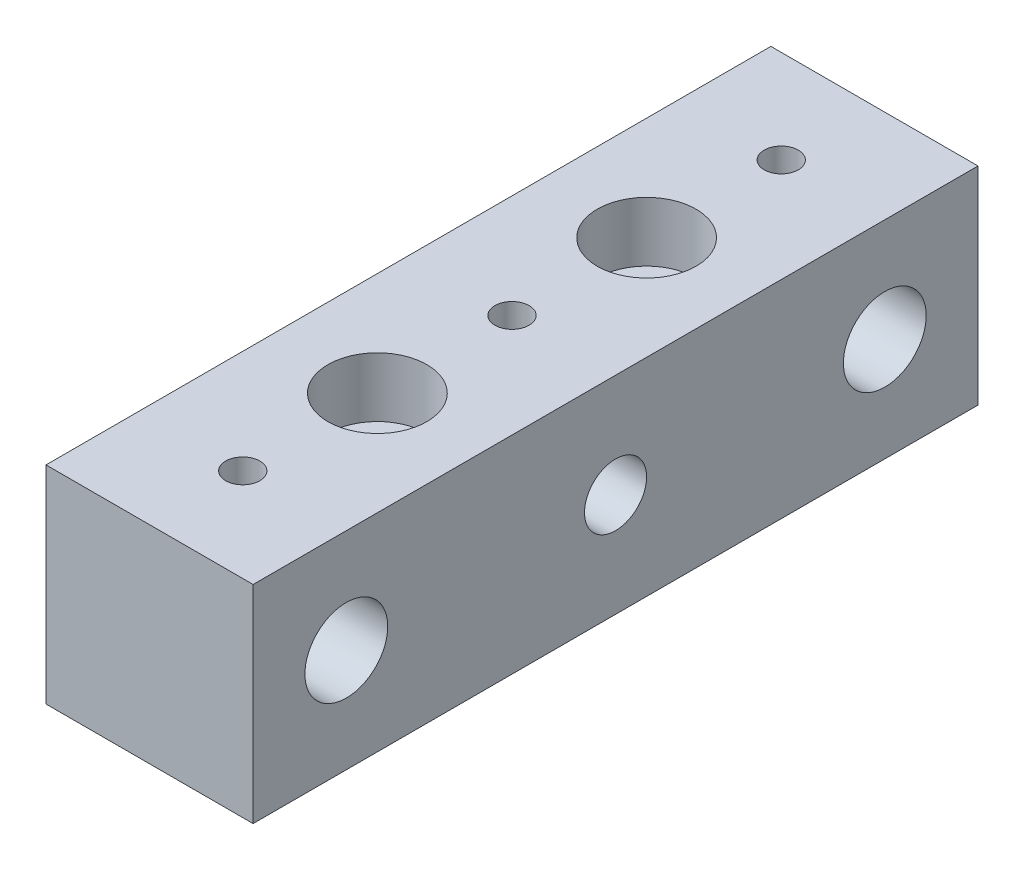
ISO-10303-21;
HEADER;
FILE_DESCRIPTION(('STEP AP214'),'2;1');
FILE_NAME('part.step','',(''),(''),'','','');
FILE_SCHEMA(('AUTOMOTIVE_DESIGN { 1 0 10303 214 1 1 1 1 }'));
ENDSEC;
DATA;
#1=APPLICATION_CONTEXT('core data for automotive mechanical design processes');
#2=APPLICATION_PROTOCOL_DEFINITION('international standard','automotive_design',2000,#1);
#3=PRODUCT_CONTEXT('',#1,'mechanical');
#4=PRODUCT('Part','Part','',(#3));
#5=PRODUCT_RELATED_PRODUCT_CATEGORY('part','',(#4));
#6=PRODUCT_DEFINITION_FORMATION('','',#4);
#7=PRODUCT_DEFINITION_CONTEXT('part definition',#1,'design');
#8=PRODUCT_DEFINITION('design','',#6,#7);
#9=PRODUCT_DEFINITION_SHAPE('','',#8);
#10=(LENGTH_UNIT() NAMED_UNIT(*) SI_UNIT(.MILLI.,.METRE.));
#11=(NAMED_UNIT(*) PLANE_ANGLE_UNIT() SI_UNIT($,.RADIAN.));
#12=(NAMED_UNIT(*) SI_UNIT($,.STERADIAN.) SOLID_ANGLE_UNIT());
#13=UNCERTAINTY_MEASURE_WITH_UNIT(LENGTH_MEASURE(1.E-05),#10,'distance_accuracy_value','');
#14=(GEOMETRIC_REPRESENTATION_CONTEXT(3) GLOBAL_UNCERTAINTY_ASSIGNED_CONTEXT((#13)) GLOBAL_UNIT_ASSIGNED_CONTEXT((#10,
#11,#12)) REPRESENTATION_CONTEXT('',''));
#15=CARTESIAN_POINT('',(0.,0.,0.));
#16=DIRECTION('',(0.,0.,1.));
#17=DIRECTION('',(1.,0.,0.));
#18=AXIS2_PLACEMENT_3D('',#15,#16,#17);
#19=CARTESIAN_POINT('',(10.,-20.,35.));
#20=DIRECTION('',(1.,0.,0.));
#21=DIRECTION('',(0.,0.,-1.));
#22=AXIS2_PLACEMENT_3D('',#19,#20,#21);
#23=PLANE('',#22);
#24=CARTESIAN_POINT('',(10.,-10.,26.));
#25=DIRECTION('',(1.,0.,0.));
#26=DIRECTION('',(0.,0.,-1.));
#27=AXIS2_PLACEMENT_3D('',#24,#25,#26);
#28=CIRCLE('',#27,4.);
#29=CARTESIAN_POINT('',(10.,-10.,22.));
#30=VERTEX_POINT('',#29);
#31=EDGE_CURVE('E200',#30,#30,#28,.T.);
#32=ORIENTED_EDGE('',*,*,#31,.F.);
#33=EDGE_LOOP('',(#32));
#34=FACE_BOUND('',#33,.T.);
#35=CARTESIAN_POINT('',(10.,-10.,-26.));
#36=DIRECTION('',(1.,0.,0.));
#37=DIRECTION('',(0.,0.,-1.));
#38=AXIS2_PLACEMENT_3D('',#35,#36,#37);
#39=CIRCLE('',#38,4.);
#40=CARTESIAN_POINT('',(10.,-10.,-30.));
#41=VERTEX_POINT('',#40);
#42=EDGE_CURVE('E205',#41,#41,#39,.T.);
#43=ORIENTED_EDGE('',*,*,#42,.F.);
#44=EDGE_LOOP('',(#43));
#45=FACE_BOUND('',#44,.T.);
#46=CARTESIAN_POINT('',(10.,-10.,0.));
#47=DIRECTION('',(1.,0.,0.));
#48=DIRECTION('',(0.,0.,-1.));
#49=AXIS2_PLACEMENT_3D('',#46,#47,#48);
#50=CIRCLE('',#49,3.);
#51=CARTESIAN_POINT('',(10.,-10.,-3.));
#52=VERTEX_POINT('',#51);
#53=EDGE_CURVE('E208',#52,#52,#50,.T.);
#54=ORIENTED_EDGE('',*,*,#53,.F.);
#55=EDGE_LOOP('',(#54));
#56=FACE_BOUND('',#55,.T.);
#57=DIRECTION('',(0.,0.,-1.));
#58=VECTOR('',#57,1.);
#59=CARTESIAN_POINT('',(10.,0.,35.));
#60=LINE('',#59,#58);
#61=CARTESIAN_POINT('',(10.,0.,35.));
#62=VERTEX_POINT('',#61);
#63=CARTESIAN_POINT('',(10.,0.,-35.));
#64=VERTEX_POINT('',#63);
#65=EDGE_CURVE('E110',#62,#64,#60,.T.);
#66=ORIENTED_EDGE('',*,*,#65,.F.);
#67=DIRECTION('',(0.,1.,0.));
#68=VECTOR('',#67,1.);
#69=CARTESIAN_POINT('',(10.,-20.,35.));
#70=LINE('',#69,#68);
#71=CARTESIAN_POINT('',(10.,-20.,35.));
#72=VERTEX_POINT('',#71);
#73=EDGE_CURVE('E11',#72,#62,#70,.T.);
#74=ORIENTED_EDGE('',*,*,#73,.F.);
#75=DIRECTION('',(0.,0.,-1.));
#76=VECTOR('',#75,1.);
#77=CARTESIAN_POINT('',(10.,-20.,35.));
#78=LINE('',#77,#76);
#79=CARTESIAN_POINT('',(10.,-20.,-35.));
#80=VERTEX_POINT('',#79);
#81=EDGE_CURVE('E99',#72,#80,#78,.T.);
#82=ORIENTED_EDGE('',*,*,#81,.T.);
#83=DIRECTION('',(0.,1.,0.));
#84=VECTOR('',#83,1.);
#85=CARTESIAN_POINT('',(10.,-20.,-35.));
#86=LINE('',#85,#84);
#87=EDGE_CURVE('E44',#80,#64,#86,.T.);
#88=ORIENTED_EDGE('',*,*,#87,.T.);
#89=EDGE_LOOP('',(#66,#74,#82,#88));
#90=FACE_BOUND('',#89,.T.);
#91=ADVANCED_FACE('F45',(#34,#45,#56,#90),#23,.T.);
#92=CARTESIAN_POINT('',(-10.,-20.,35.));
#93=DIRECTION('',(0.,0.,1.));
#94=DIRECTION('',(1.,0.,0.));
#95=AXIS2_PLACEMENT_3D('',#92,#93,#94);
#96=PLANE('',#95);
#97=DIRECTION('',(1.,0.,0.));
#98=VECTOR('',#97,1.);
#99=CARTESIAN_POINT('',(-10.,0.,35.));
#100=LINE('',#99,#98);
#101=CARTESIAN_POINT('',(-10.,0.,35.));
#102=VERTEX_POINT('',#101);
#103=EDGE_CURVE('E105',#102,#62,#100,.T.);
#104=ORIENTED_EDGE('',*,*,#103,.F.);
#105=DIRECTION('',(0.,1.,0.));
#106=VECTOR('',#105,1.);
#107=CARTESIAN_POINT('',(-10.,-20.,35.));
#108=LINE('',#107,#106);
#109=CARTESIAN_POINT('',(-10.,-20.,35.));
#110=VERTEX_POINT('',#109);
#111=EDGE_CURVE('E51',#110,#102,#108,.T.);
#112=ORIENTED_EDGE('',*,*,#111,.F.);
#113=DIRECTION('',(1.,0.,0.));
#114=VECTOR('',#113,1.);
#115=CARTESIAN_POINT('',(-10.,-20.,35.));
#116=LINE('',#115,#114);
#117=EDGE_CURVE('E100',#110,#72,#116,.T.);
#118=ORIENTED_EDGE('',*,*,#117,.T.);
#119=ORIENTED_EDGE('',*,*,#73,.T.);
#120=EDGE_LOOP('',(#104,#112,#118,#119));
#121=FACE_BOUND('',#120,.T.);
#122=ADVANCED_FACE('F117',(#121),#96,.T.);
#123=CARTESIAN_POINT('',(-10.,-20.,35.));
#124=DIRECTION('',(-1.,0.,0.));
#125=DIRECTION('',(0.,0.,1.));
#126=AXIS2_PLACEMENT_3D('',#123,#124,#125);
#127=PLANE('',#126);
#128=CARTESIAN_POINT('',(-10.,-10.,26.));
#129=DIRECTION('',(1.,0.,0.));
#130=DIRECTION('',(0.,0.,-1.));
#131=AXIS2_PLACEMENT_3D('',#128,#129,#130);
#132=CIRCLE('',#131,4.);
#133=CARTESIAN_POINT('',(-10.,-10.,22.));
#134=VERTEX_POINT('',#133);
#135=EDGE_CURVE('E191',#134,#134,#132,.T.);
#136=ORIENTED_EDGE('',*,*,#135,.T.);
#137=EDGE_LOOP('',(#136));
#138=FACE_BOUND('',#137,.T.);
#139=CARTESIAN_POINT('',(-10.,-10.,-26.));
#140=DIRECTION('',(1.,0.,0.));
#141=DIRECTION('',(0.,0.,-1.));
#142=AXIS2_PLACEMENT_3D('',#139,#140,#141);
#143=CIRCLE('',#142,4.);
#144=CARTESIAN_POINT('',(-10.,-10.,-30.));
#145=VERTEX_POINT('',#144);
#146=EDGE_CURVE('E202',#145,#145,#143,.T.);
#147=ORIENTED_EDGE('',*,*,#146,.T.);
#148=EDGE_LOOP('',(#147));
#149=FACE_BOUND('',#148,.T.);
#150=CARTESIAN_POINT('',(-10.,-10.,0.));
#151=DIRECTION('',(1.,0.,0.));
#152=DIRECTION('',(0.,0.,-1.));
#153=AXIS2_PLACEMENT_3D('',#150,#151,#152);
#154=CIRCLE('',#153,3.);
#155=CARTESIAN_POINT('',(-10.,-10.,-3.));
#156=VERTEX_POINT('',#155);
#157=EDGE_CURVE('E211',#156,#156,#154,.T.);
#158=ORIENTED_EDGE('',*,*,#157,.T.);
#159=EDGE_LOOP('',(#158));
#160=FACE_BOUND('',#159,.T.);
#161=DIRECTION('',(0.,0.,1.));
#162=VECTOR('',#161,1.);
#163=CARTESIAN_POINT('',(-10.,0.,35.));
#164=LINE('',#163,#162);
#165=CARTESIAN_POINT('',(-10.,0.,-35.));
#166=VERTEX_POINT('',#165);
#167=EDGE_CURVE('E95',#166,#102,#164,.T.);
#168=ORIENTED_EDGE('',*,*,#167,.F.);
#169=DIRECTION('',(0.,1.,0.));
#170=VECTOR('',#169,1.);
#171=CARTESIAN_POINT('',(-10.,-20.,-35.));
#172=LINE('',#171,#170);
#173=CARTESIAN_POINT('',(-10.,-20.,-35.));
#174=VERTEX_POINT('',#173);
#175=EDGE_CURVE('E87',#174,#166,#172,.T.);
#176=ORIENTED_EDGE('',*,*,#175,.F.);
#177=DIRECTION('',(0.,0.,1.));
#178=VECTOR('',#177,1.);
#179=CARTESIAN_POINT('',(-10.,-20.,35.));
#180=LINE('',#179,#178);
#181=EDGE_CURVE('E89',#174,#110,#180,.T.);
#182=ORIENTED_EDGE('',*,*,#181,.T.);
#183=ORIENTED_EDGE('',*,*,#111,.T.);
#184=EDGE_LOOP('',(#168,#176,#182,#183));
#185=FACE_BOUND('',#184,.T.);
#186=ADVANCED_FACE('F90',(#138,#149,#160,#185),#127,.T.);
#187=CARTESIAN_POINT('',(-10.,-20.,-35.));
#188=DIRECTION('',(0.,0.,-1.));
#189=DIRECTION('',(-1.,0.,0.));
#190=AXIS2_PLACEMENT_3D('',#187,#188,#189);
#191=PLANE('',#190);
#192=DIRECTION('',(-1.,0.,0.));
#193=VECTOR('',#192,1.);
#194=CARTESIAN_POINT('',(-10.,0.,-35.));
#195=LINE('',#194,#193);
#196=EDGE_CURVE('E109',#64,#166,#195,.T.);
#197=ORIENTED_EDGE('',*,*,#196,.F.);
#198=ORIENTED_EDGE('',*,*,#87,.F.);
#199=DIRECTION('',(-1.,0.,0.));
#200=VECTOR('',#199,1.);
#201=CARTESIAN_POINT('',(-10.,-20.,-35.));
#202=LINE('',#201,#200);
#203=EDGE_CURVE('E96',#80,#174,#202,.T.);
#204=ORIENTED_EDGE('',*,*,#203,.T.);
#205=ORIENTED_EDGE('',*,*,#175,.T.);
#206=EDGE_LOOP('',(#197,#198,#204,#205));
#207=FACE_BOUND('',#206,.T.);
#208=ADVANCED_FACE('F97',(#207),#191,.T.);
#209=CARTESIAN_POINT('',(0.,-20.,0.));
#210=DIRECTION('',(0.,-1.,0.));
#211=DIRECTION('',(0.,0.,-1.));
#212=AXIS2_PLACEMENT_3D('',#209,#210,#211);
#213=PLANE('',#212);
#214=CARTESIAN_POINT('',(0.,-20.,-13.));
#215=DIRECTION('',(0.,1.,0.));
#216=DIRECTION('',(0.,0.,1.));
#217=AXIS2_PLACEMENT_3D('',#214,#215,#216);
#218=CIRCLE('',#217,2.65);
#219=CARTESIAN_POINT('',(0.,-20.,-10.35));
#220=VERTEX_POINT('',#219);
#221=EDGE_CURVE('E214',#220,#220,#218,.T.);
#222=ORIENTED_EDGE('',*,*,#221,.T.);
#223=EDGE_LOOP('',(#222));
#224=FACE_BOUND('',#223,.T.);
#225=CARTESIAN_POINT('',(0.,-20.,13.));
#226=DIRECTION('',(0.,1.,0.));
#227=DIRECTION('',(0.,0.,1.));
#228=AXIS2_PLACEMENT_3D('',#225,#226,#227);
#229=CIRCLE('',#228,2.65);
#230=CARTESIAN_POINT('',(0.,-20.,15.65));
#231=VERTEX_POINT('',#230);
#232=EDGE_CURVE('E196',#231,#231,#229,.T.);
#233=ORIENTED_EDGE('',*,*,#232,.T.);
#234=EDGE_LOOP('',(#233));
#235=FACE_BOUND('',#234,.T.);
#236=ORIENTED_EDGE('',*,*,#81,.F.);
#237=ORIENTED_EDGE('',*,*,#117,.F.);
#238=ORIENTED_EDGE('',*,*,#181,.F.);
#239=ORIENTED_EDGE('',*,*,#203,.F.);
#240=EDGE_LOOP('',(#236,#237,#238,#239));
#241=FACE_BOUND('',#240,.T.);
#242=ADVANCED_FACE('F92',(#224,#235,#241),#213,.T.);
#243=CARTESIAN_POINT('',(0.,0.,0.));
#244=DIRECTION('',(0.,-1.,0.));
#245=DIRECTION('',(0.,0.,-1.));
#246=AXIS2_PLACEMENT_3D('',#243,#244,#245);
#247=PLANE('',#246);
#248=CARTESIAN_POINT('',(0.,0.,26.));
#249=DIRECTION('',(0.,1.,0.));
#250=DIRECTION('',(0.,0.,1.));
#251=AXIS2_PLACEMENT_3D('',#248,#249,#250);
#252=CIRCLE('',#251,1.65);
#253=CARTESIAN_POINT('',(0.,0.,27.65));
#254=VERTEX_POINT('',#253);
#255=EDGE_CURVE('E212',#254,#254,#252,.T.);
#256=ORIENTED_EDGE('',*,*,#255,.F.);
#257=EDGE_LOOP('',(#256));
#258=FACE_BOUND('',#257,.T.);
#259=CARTESIAN_POINT('',(0.,0.,-26.));
#260=DIRECTION('',(0.,1.,0.));
#261=DIRECTION('',(0.,0.,1.));
#262=AXIS2_PLACEMENT_3D('',#259,#260,#261);
#263=CIRCLE('',#262,1.65);
#264=CARTESIAN_POINT('',(0.,0.,-24.35));
#265=VERTEX_POINT('',#264);
#266=EDGE_CURVE('E194',#265,#265,#263,.T.);
#267=ORIENTED_EDGE('',*,*,#266,.F.);
#268=EDGE_LOOP('',(#267));
#269=FACE_BOUND('',#268,.T.);
#270=CARTESIAN_POINT('',(0.,0.,0.));
#271=DIRECTION('',(0.,1.,0.));
#272=DIRECTION('',(0.,0.,1.));
#273=AXIS2_PLACEMENT_3D('',#270,#271,#272);
#274=CIRCLE('',#273,1.65);
#275=CARTESIAN_POINT('',(0.,0.,1.65));
#276=VERTEX_POINT('',#275);
#277=EDGE_CURVE('E192',#276,#276,#274,.T.);
#278=ORIENTED_EDGE('',*,*,#277,.F.);
#279=EDGE_LOOP('',(#278));
#280=FACE_BOUND('',#279,.T.);
#281=CARTESIAN_POINT('',(0.,0.,-13.));
#282=DIRECTION('',(0.,1.,0.));
#283=DIRECTION('',(0.,0.,1.));
#284=AXIS2_PLACEMENT_3D('',#281,#282,#283);
#285=CIRCLE('',#284,4.775);
#286=CARTESIAN_POINT('',(0.,0.,-8.225));
#287=VERTEX_POINT('',#286);
#288=EDGE_CURVE('E227',#287,#287,#285,.T.);
#289=ORIENTED_EDGE('',*,*,#288,.F.);
#290=EDGE_LOOP('',(#289));
#291=FACE_BOUND('',#290,.T.);
#292=CARTESIAN_POINT('',(0.,0.,13.));
#293=DIRECTION('',(0.,1.,0.));
#294=DIRECTION('',(0.,0.,1.));
#295=AXIS2_PLACEMENT_3D('',#292,#293,#294);
#296=CIRCLE('',#295,4.775);
#297=CARTESIAN_POINT('',(0.,0.,17.775));
#298=VERTEX_POINT('',#297);
#299=EDGE_CURVE('E233',#298,#298,#296,.T.);
#300=ORIENTED_EDGE('',*,*,#299,.F.);
#301=EDGE_LOOP('',(#300));
#302=FACE_BOUND('',#301,.T.);
#303=ORIENTED_EDGE('',*,*,#65,.T.);
#304=ORIENTED_EDGE('',*,*,#196,.T.);
#305=ORIENTED_EDGE('',*,*,#167,.T.);
#306=ORIENTED_EDGE('',*,*,#103,.T.);
#307=EDGE_LOOP('',(#303,#304,#305,#306));
#308=FACE_BOUND('',#307,.T.);
#309=ADVANCED_FACE('F119',(#258,#269,#280,#291,#302,#308),#247,.F.);
#310=CARTESIAN_POINT('',(0.,-5.75,13.));
#311=DIRECTION('',(0.,1.,0.));
#312=DIRECTION('',(0.,0.,1.));
#313=AXIS2_PLACEMENT_3D('',#310,#311,#312);
#314=CYLINDRICAL_SURFACE('',#313,4.775);
#315=CARTESIAN_POINT('',(0.,-5.75,13.));
#316=DIRECTION('',(0.,1.,0.));
#317=DIRECTION('',(0.,0.,1.));
#318=AXIS2_PLACEMENT_3D('',#315,#316,#317);
#319=CIRCLE('',#318,4.775);
#320=CARTESIAN_POINT('',(0.,-5.75,17.775));
#321=VERTEX_POINT('',#320);
#322=EDGE_CURVE('E220',#321,#321,#319,.T.);
#323=ORIENTED_EDGE('',*,*,#322,.F.);
#324=EDGE_LOOP('',(#323));
#325=FACE_BOUND('',#324,.T.);
#326=ORIENTED_EDGE('',*,*,#299,.T.);
#327=EDGE_LOOP('',(#326));
#328=FACE_BOUND('',#327,.T.);
#329=ADVANCED_FACE('F143',(#325,#328),#314,.F.);
#330=CARTESIAN_POINT('',(0.,-5.75,13.));
#331=DIRECTION('',(0.,1.,0.));
#332=DIRECTION('',(0.,0.,1.));
#333=AXIS2_PLACEMENT_3D('',#330,#331,#332);
#334=PLANE('',#333);
#335=CARTESIAN_POINT('',(0.,-5.75,13.));
#336=DIRECTION('',(0.,1.,0.));
#337=DIRECTION('',(0.,0.,1.));
#338=AXIS2_PLACEMENT_3D('',#335,#336,#337);
#339=CIRCLE('',#338,2.65);
#340=CARTESIAN_POINT('',(0.,-5.75,15.65));
#341=VERTEX_POINT('',#340);
#342=EDGE_CURVE('E222',#341,#341,#339,.T.);
#343=ORIENTED_EDGE('',*,*,#342,.F.);
#344=EDGE_LOOP('',(#343));
#345=FACE_BOUND('',#344,.T.);
#346=ORIENTED_EDGE('',*,*,#322,.T.);
#347=EDGE_LOOP('',(#346));
#348=FACE_BOUND('',#347,.T.);
#349=ADVANCED_FACE('F148',(#345,#348),#334,.T.);
#350=CARTESIAN_POINT('',(0.,-5.75,-13.));
#351=DIRECTION('',(0.,1.,0.));
#352=DIRECTION('',(0.,0.,1.));
#353=AXIS2_PLACEMENT_3D('',#350,#351,#352);
#354=CYLINDRICAL_SURFACE('',#353,4.775);
#355=CARTESIAN_POINT('',(0.,-5.75,-13.));
#356=DIRECTION('',(0.,1.,0.));
#357=DIRECTION('',(0.,0.,1.));
#358=AXIS2_PLACEMENT_3D('',#355,#356,#357);
#359=CIRCLE('',#358,4.775);
#360=CARTESIAN_POINT('',(0.,-5.75,-8.225));
#361=VERTEX_POINT('',#360);
#362=EDGE_CURVE('E112',#361,#361,#359,.T.);
#363=ORIENTED_EDGE('',*,*,#362,.F.);
#364=EDGE_LOOP('',(#363));
#365=FACE_BOUND('',#364,.T.);
#366=ORIENTED_EDGE('',*,*,#288,.T.);
#367=EDGE_LOOP('',(#366));
#368=FACE_BOUND('',#367,.T.);
#369=ADVANCED_FACE('F146',(#365,#368),#354,.F.);
#370=CARTESIAN_POINT('',(0.,-5.75,-13.));
#371=DIRECTION('',(0.,1.,0.));
#372=DIRECTION('',(0.,0.,1.));
#373=AXIS2_PLACEMENT_3D('',#370,#371,#372);
#374=PLANE('',#373);
#375=CARTESIAN_POINT('',(0.,-5.75,-13.));
#376=DIRECTION('',(0.,1.,0.));
#377=DIRECTION('',(0.,0.,1.));
#378=AXIS2_PLACEMENT_3D('',#375,#376,#377);
#379=CIRCLE('',#378,2.65);
#380=CARTESIAN_POINT('',(0.,-5.75,-10.35));
#381=VERTEX_POINT('',#380);
#382=EDGE_CURVE('E217',#381,#381,#379,.T.);
#383=ORIENTED_EDGE('',*,*,#382,.F.);
#384=EDGE_LOOP('',(#383));
#385=FACE_BOUND('',#384,.T.);
#386=ORIENTED_EDGE('',*,*,#362,.T.);
#387=EDGE_LOOP('',(#386));
#388=FACE_BOUND('',#387,.T.);
#389=ADVANCED_FACE('F153',(#385,#388),#374,.T.);
#390=CARTESIAN_POINT('',(0.,-20.,13.));
#391=DIRECTION('',(0.,1.,0.));
#392=DIRECTION('',(0.,0.,1.));
#393=AXIS2_PLACEMENT_3D('',#390,#391,#392);
#394=CYLINDRICAL_SURFACE('',#393,2.65);
#395=CARTESIAN_POINT('',(0.,-20.,15.65));
#396=CARTESIAN_POINT('',(0.,-19.8515625,15.65));
#397=CARTESIAN_POINT('',(0.,-19.703125,15.65));
#398=CARTESIAN_POINT('',(0.,-19.40625,15.65));
#399=CARTESIAN_POINT('',(0.,-19.2578125,15.65));
#400=CARTESIAN_POINT('',(0.,-18.9609375,15.65));
#401=CARTESIAN_POINT('',(0.,-18.8125,15.65));
#402=CARTESIAN_POINT('',(0.,-18.515625,15.65));
#403=CARTESIAN_POINT('',(0.,-18.3671875,15.65));
#404=CARTESIAN_POINT('',(0.,-18.0703125,15.65));
#405=CARTESIAN_POINT('',(0.,-17.921875,15.65));
#406=CARTESIAN_POINT('',(0.,-17.625,15.65));
#407=CARTESIAN_POINT('',(0.,-17.4765625,15.65));
#408=CARTESIAN_POINT('',(0.,-17.1796875,15.65));
#409=CARTESIAN_POINT('',(0.,-17.03125,15.65));
#410=CARTESIAN_POINT('',(0.,-16.734375,15.65));
#411=CARTESIAN_POINT('',(0.,-16.5859375,15.65));
#412=CARTESIAN_POINT('',(0.,-16.2890625,15.65));
#413=CARTESIAN_POINT('',(0.,-16.140625,15.65));
#414=CARTESIAN_POINT('',(0.,-15.84375,15.65));
#415=CARTESIAN_POINT('',(0.,-15.6953125,15.65));
#416=CARTESIAN_POINT('',(0.,-15.3984375,15.65));
#417=CARTESIAN_POINT('',(0.,-15.25,15.65));
#418=CARTESIAN_POINT('',(0.,-14.953125,15.65));
#419=CARTESIAN_POINT('',(0.,-14.8046875,15.65));
#420=CARTESIAN_POINT('',(0.,-14.5078125,15.65));
#421=CARTESIAN_POINT('',(0.,-14.359375,15.65));
#422=CARTESIAN_POINT('',(0.,-14.0625,15.65));
#423=CARTESIAN_POINT('',(0.,-13.9140625,15.65));
#424=CARTESIAN_POINT('',(0.,-13.6171875,15.65));
#425=CARTESIAN_POINT('',(0.,-13.46875,15.65));
#426=CARTESIAN_POINT('',(0.,-13.171875,15.65));
#427=CARTESIAN_POINT('',(0.,-13.0234375,15.65));
#428=CARTESIAN_POINT('',(0.,-12.7265625,15.65));
#429=CARTESIAN_POINT('',(0.,-12.578125,15.65));
#430=CARTESIAN_POINT('',(0.,-12.28125,15.65));
#431=CARTESIAN_POINT('',(0.,-12.1328125,15.65));
#432=CARTESIAN_POINT('',(0.,-11.8359375,15.65));
#433=CARTESIAN_POINT('',(0.,-11.6875,15.65));
#434=CARTESIAN_POINT('',(0.,-11.390625,15.65));
#435=CARTESIAN_POINT('',(0.,-11.2421875,15.65));
#436=CARTESIAN_POINT('',(0.,-10.9453125,15.65));
#437=CARTESIAN_POINT('',(0.,-10.796875,15.65));
#438=CARTESIAN_POINT('',(0.,-10.5,15.65));
#439=CARTESIAN_POINT('',(0.,-10.3515625,15.65));
#440=CARTESIAN_POINT('',(0.,-10.0546875,15.65));
#441=CARTESIAN_POINT('',(0.,-9.90625,15.65));
#442=CARTESIAN_POINT('',(0.,-9.609375,15.65));
#443=CARTESIAN_POINT('',(0.,-9.4609375,15.65));
#444=CARTESIAN_POINT('',(0.,-9.1640625,15.65));
#445=CARTESIAN_POINT('',(0.,-9.015625,15.65));
#446=CARTESIAN_POINT('',(0.,-8.71875,15.65));
#447=CARTESIAN_POINT('',(0.,-8.5703125,15.65));
#448=CARTESIAN_POINT('',(0.,-8.2734375,15.65));
#449=CARTESIAN_POINT('',(0.,-8.125,15.65));
#450=CARTESIAN_POINT('',(0.,-7.828125,15.65));
#451=CARTESIAN_POINT('',(0.,-7.6796875,15.65));
#452=CARTESIAN_POINT('',(0.,-7.3828125,15.65));
#453=CARTESIAN_POINT('',(0.,-7.234375,15.65));
#454=CARTESIAN_POINT('',(0.,-6.9375,15.65));
#455=CARTESIAN_POINT('',(0.,-6.7890625,15.65));
#456=CARTESIAN_POINT('',(0.,-6.4921875,15.65));
#457=CARTESIAN_POINT('',(0.,-6.34375,15.65));
#458=CARTESIAN_POINT('',(0.,-6.046875,15.65));
#459=CARTESIAN_POINT('',(0.,-5.8984375,15.65));
#460=CARTESIAN_POINT('',(0.,-5.75,15.65));
#461=B_SPLINE_CURVE_WITH_KNOTS('',3,(#395,#396,#397,#398,#399,#400,#401,#402,#403,#404,#405,
#406,#407,#408,#409,#410,#411,#412,#413,#414,#415,#416,#417,#418,#419,#420,#421,#422,#423,#424,
#425,#426,#427,#428,#429,#430,#431,#432,#433,#434,#435,#436,#437,#438,#439,#440,#441,#442,#443,
#444,#445,#446,#447,#448,#449,#450,#451,#452,#453,#454,#455,#456,#457,#458,#459,#460),
.UNSPECIFIED.,.F.,.F.,(4,2,2,2,2,2,2,2,2,2,2,2,2,2,2,2,2,2,2,2,2,2,2,2,2,2,2,2,2,2,2,2,4),(0.,
0.445312500000003,0.890625000000003,1.3359375,1.78125,2.2265625,2.671875,3.1171875,3.5625,
4.0078125,4.453125,4.8984375,5.34375,5.7890625,6.234375,6.6796875,7.125,7.5703125,8.015625,
8.4609375,8.90625,9.3515625,9.796875,10.2421875,10.6875,11.1328125,11.578125,12.0234375,
12.46875,12.9140625,13.359375,13.8046875,14.25),.UNSPECIFIED.);
#462=EDGE_CURVE('BSEAM160',#231,#341,#461,.T.);
#463=ORIENTED_EDGE('',*,*,#232,.F.);
#464=ORIENTED_EDGE('',*,*,#342,.T.);
#465=ORIENTED_EDGE('',*,*,#462,.T.);
#466=ORIENTED_EDGE('',*,*,#462,.F.);
#467=EDGE_LOOP('',(#463,#465,#464,#466));
#468=FACE_BOUND('',#467,.T.);
#469=ADVANCED_FACE('F160',(#468),#394,.F.);
#470=CARTESIAN_POINT('',(0.,-20.,-13.));
#471=DIRECTION('',(0.,1.,0.));
#472=DIRECTION('',(0.,0.,1.));
#473=AXIS2_PLACEMENT_3D('',#470,#471,#472);
#474=CYLINDRICAL_SURFACE('',#473,2.65);
#475=CARTESIAN_POINT('',(0.,-20.,-10.35));
#476=CARTESIAN_POINT('',(0.,-19.8515625,-10.35));
#477=CARTESIAN_POINT('',(0.,-19.703125,-10.35));
#478=CARTESIAN_POINT('',(0.,-19.40625,-10.35));
#479=CARTESIAN_POINT('',(0.,-19.2578125,-10.35));
#480=CARTESIAN_POINT('',(0.,-18.9609375,-10.35));
#481=CARTESIAN_POINT('',(0.,-18.8125,-10.35));
#482=CARTESIAN_POINT('',(0.,-18.515625,-10.35));
#483=CARTESIAN_POINT('',(0.,-18.3671875,-10.35));
#484=CARTESIAN_POINT('',(0.,-18.0703125,-10.35));
#485=CARTESIAN_POINT('',(0.,-17.921875,-10.35));
#486=CARTESIAN_POINT('',(0.,-17.625,-10.35));
#487=CARTESIAN_POINT('',(0.,-17.4765625,-10.35));
#488=CARTESIAN_POINT('',(0.,-17.1796875,-10.35));
#489=CARTESIAN_POINT('',(0.,-17.03125,-10.35));
#490=CARTESIAN_POINT('',(0.,-16.734375,-10.35));
#491=CARTESIAN_POINT('',(0.,-16.5859375,-10.35));
#492=CARTESIAN_POINT('',(0.,-16.2890625,-10.35));
#493=CARTESIAN_POINT('',(0.,-16.140625,-10.35));
#494=CARTESIAN_POINT('',(0.,-15.84375,-10.35));
#495=CARTESIAN_POINT('',(0.,-15.6953125,-10.35));
#496=CARTESIAN_POINT('',(0.,-15.3984375,-10.35));
#497=CARTESIAN_POINT('',(0.,-15.25,-10.35));
#498=CARTESIAN_POINT('',(0.,-14.953125,-10.35));
#499=CARTESIAN_POINT('',(0.,-14.8046875,-10.35));
#500=CARTESIAN_POINT('',(0.,-14.5078125,-10.35));
#501=CARTESIAN_POINT('',(0.,-14.359375,-10.35));
#502=CARTESIAN_POINT('',(0.,-14.0625,-10.35));
#503=CARTESIAN_POINT('',(0.,-13.9140625,-10.35));
#504=CARTESIAN_POINT('',(0.,-13.6171875,-10.35));
#505=CARTESIAN_POINT('',(0.,-13.46875,-10.35));
#506=CARTESIAN_POINT('',(0.,-13.171875,-10.35));
#507=CARTESIAN_POINT('',(0.,-13.0234375,-10.35));
#508=CARTESIAN_POINT('',(0.,-12.7265625,-10.35));
#509=CARTESIAN_POINT('',(0.,-12.578125,-10.35));
#510=CARTESIAN_POINT('',(0.,-12.28125,-10.35));
#511=CARTESIAN_POINT('',(0.,-12.1328125,-10.35));
#512=CARTESIAN_POINT('',(0.,-11.8359375,-10.35));
#513=CARTESIAN_POINT('',(0.,-11.6875,-10.35));
#514=CARTESIAN_POINT('',(0.,-11.390625,-10.35));
#515=CARTESIAN_POINT('',(0.,-11.2421875,-10.35));
#516=CARTESIAN_POINT('',(0.,-10.9453125,-10.35));
#517=CARTESIAN_POINT('',(0.,-10.796875,-10.35));
#518=CARTESIAN_POINT('',(0.,-10.5,-10.35));
#519=CARTESIAN_POINT('',(0.,-10.3515625,-10.35));
#520=CARTESIAN_POINT('',(0.,-10.0546875,-10.35));
#521=CARTESIAN_POINT('',(0.,-9.90625,-10.35));
#522=CARTESIAN_POINT('',(0.,-9.609375,-10.35));
#523=CARTESIAN_POINT('',(0.,-9.4609375,-10.35));
#524=CARTESIAN_POINT('',(0.,-9.1640625,-10.35));
#525=CARTESIAN_POINT('',(0.,-9.015625,-10.35));
#526=CARTESIAN_POINT('',(0.,-8.71875,-10.35));
#527=CARTESIAN_POINT('',(0.,-8.5703125,-10.35));
#528=CARTESIAN_POINT('',(0.,-8.2734375,-10.35));
#529=CARTESIAN_POINT('',(0.,-8.125,-10.35));
#530=CARTESIAN_POINT('',(0.,-7.828125,-10.35));
#531=CARTESIAN_POINT('',(0.,-7.6796875,-10.35));
#532=CARTESIAN_POINT('',(0.,-7.3828125,-10.35));
#533=CARTESIAN_POINT('',(0.,-7.234375,-10.35));
#534=CARTESIAN_POINT('',(0.,-6.9375,-10.35));
#535=CARTESIAN_POINT('',(0.,-6.7890625,-10.35));
#536=CARTESIAN_POINT('',(0.,-6.4921875,-10.35));
#537=CARTESIAN_POINT('',(0.,-6.34375,-10.35));
#538=CARTESIAN_POINT('',(0.,-6.046875,-10.35));
#539=CARTESIAN_POINT('',(0.,-5.8984375,-10.35));
#540=CARTESIAN_POINT('',(0.,-5.75,-10.35));
#541=B_SPLINE_CURVE_WITH_KNOTS('',3,(#475,#476,#477,#478,#479,#480,#481,#482,#483,#484,#485,
#486,#487,#488,#489,#490,#491,#492,#493,#494,#495,#496,#497,#498,#499,#500,#501,#502,#503,#504,
#505,#506,#507,#508,#509,#510,#511,#512,#513,#514,#515,#516,#517,#518,#519,#520,#521,#522,#523,
#524,#525,#526,#527,#528,#529,#530,#531,#532,#533,#534,#535,#536,#537,#538,#539,#540),
.UNSPECIFIED.,.F.,.F.,(4,2,2,2,2,2,2,2,2,2,2,2,2,2,2,2,2,2,2,2,2,2,2,2,2,2,2,2,2,2,2,2,4),(0.,
0.445312500000003,0.890625000000003,1.3359375,1.78125,2.2265625,2.671875,3.1171875,3.5625,
4.0078125,4.453125,4.8984375,5.34375,5.7890625,6.234375,6.6796875,7.125,7.5703125,8.015625,
8.4609375,8.90625,9.3515625,9.796875,10.2421875,10.6875,11.1328125,11.578125,12.0234375,
12.46875,12.9140625,13.359375,13.8046875,14.25),.UNSPECIFIED.);
#542=EDGE_CURVE('BSEAM161',#220,#381,#541,.T.);
#543=ORIENTED_EDGE('',*,*,#221,.F.);
#544=ORIENTED_EDGE('',*,*,#382,.T.);
#545=ORIENTED_EDGE('',*,*,#542,.T.);
#546=ORIENTED_EDGE('',*,*,#542,.F.);
#547=EDGE_LOOP('',(#543,#545,#544,#546));
#548=FACE_BOUND('',#547,.T.);
#549=ADVANCED_FACE('F161',(#548),#474,.F.);
#550=CARTESIAN_POINT('',(-10.,-10.,0.));
#551=DIRECTION('',(1.,0.,0.));
#552=DIRECTION('',(0.,0.,-1.));
#553=AXIS2_PLACEMENT_3D('',#550,#551,#552);
#554=CYLINDRICAL_SURFACE('',#553,3.);
#555=CARTESIAN_POINT('',(0.,-7.49450603672649,1.65));
#556=CARTESIAN_POINT('',(-0.0845622441242159,-7.49449709270855,1.64999358115515));
#557=CARTESIAN_POINT('',(-0.169198419643748,-7.49015721695367,1.64345412095509));
#558=CARTESIAN_POINT('',(-0.335758010656105,-7.47347694527907,1.61768357796129));
#559=CARTESIAN_POINT('',(-0.417676607737087,-7.4611230618666,1.5984310983052));
#560=CARTESIAN_POINT('',(-0.576058158341647,-7.43030485575939,1.54839133504122));
#561=CARTESIAN_POINT('',(-0.652551663639783,-7.41187871746233,1.51767597794516));
#562=CARTESIAN_POINT('',(-0.799270749323263,-7.37105426039296,1.44580368027316));
#563=CARTESIAN_POINT('',(-0.869495019378769,-7.34865511413261,1.40464456372702));
#564=CARTESIAN_POINT('',(-1.0094930204861,-7.29965772830515,1.30818987552103));
#565=CARTESIAN_POINT('',(-1.07850385692035,-7.27286389707157,1.25188597568528));
#566=CARTESIAN_POINT('',(-1.20671542475616,-7.21966597877671,1.12882249865068));
#567=CARTESIAN_POINT('',(-1.26591027944563,-7.1932621337497,1.06205670422282));
#568=CARTESIAN_POINT('',(-1.37781278752496,-7.14111744666044,0.912984038802344));
#569=CARTESIAN_POINT('',(-1.42952708912563,-7.11562817127672,0.829835009326254));
#570=CARTESIAN_POINT('',(-1.51787790618033,-7.07083622535221,0.654349556397894));
#571=CARTESIAN_POINT('',(-1.55452591089576,-7.05152884311584,0.562020200659685));
#572=CARTESIAN_POINT('',(-1.60849398479963,-7.0227061766961,0.378922854343172));
#573=CARTESIAN_POINT('',(-1.62716814327196,-7.01250999379445,0.288663762188309));
#574=CARTESIAN_POINT('',(-1.64917477835194,-7.00046879782472,0.105768848971925));
#575=CARTESIAN_POINT('',(-1.65251888599857,-6.99861745347504,0.0131348834272882));
#576=CARTESIAN_POINT('',(-1.6441598762631,-7.00320873616293,-0.161456942743377));
#577=CARTESIAN_POINT('',(-1.63399569896197,-7.00880319411737,-0.243517036042416));
#578=CARTESIAN_POINT('',(-1.60174386066673,-7.02629860909363,-0.404548934713679));
#579=CARTESIAN_POINT('',(-1.57965528402605,-7.03820005041257,-0.483520502425807));
#580=CARTESIAN_POINT('',(-1.52418240454989,-7.06741207866715,-0.637279429786406));
#581=CARTESIAN_POINT('',(-1.49067904874512,-7.08477952262451,-0.712012587065491));
#582=CARTESIAN_POINT('',(-1.41356855385775,-7.12344578060584,-0.854941741305337));
#583=CARTESIAN_POINT('',(-1.36995818281495,-7.14474585173756,-0.923135637298119));
#584=CARTESIAN_POINT('',(-1.26851524995847,-7.19208185617562,-1.05891717191853));
#585=CARTESIAN_POINT('',(-1.2096560691274,-7.21838079827465,-1.12564617195586));
#586=CARTESIAN_POINT('',(-1.08207579455025,-7.27144362000221,-1.24879377983835));
#587=CARTESIAN_POINT('',(-1.01334455874152,-7.29820795258613,-1.3052016470546));
#588=CARTESIAN_POINT('',(-0.86070204577057,-7.35183739258621,-1.41104757147093));
#589=CARTESIAN_POINT('',(-0.77598782502349,-7.37850506442472,-1.45943898084593));
#590=CARTESIAN_POINT('',(-0.5979123412443,-7.42557330545189,-1.54096072440202));
#591=CARTESIAN_POINT('',(-0.504561226104887,-7.44598111093368,-1.57410870202277));
#592=CARTESIAN_POINT('',(-0.319617566085951,-7.47571131114628,-1.621324807476));
#593=CARTESIAN_POINT('',(-0.228492292818842,-7.48579611824246,-1.63671808149072));
#594=CARTESIAN_POINT('',(-0.0444385673954549,-7.49578867716069,-1.65197600548299));
#595=CARTESIAN_POINT('',(0.0484877010051982,-7.49570806671446,-1.65185841284551));
#596=CARTESIAN_POINT('',(0.218980696775526,-7.48618708364219,-1.63731066997579));
#597=CARTESIAN_POINT('',(0.296816762788184,-7.47810881719227,-1.6249632757909));
#598=CARTESIAN_POINT('',(0.449094842708403,-7.45569101683773,-1.58963092545288));
#599=CARTESIAN_POINT('',(0.523535351197223,-7.44134873501823,-1.56664130047228));
#600=CARTESIAN_POINT('',(0.670568414340693,-7.40735298947038,-1.50974087534156));
#601=CARTESIAN_POINT('',(0.742950820695036,-7.38750113804147,-1.47541058671725));
#602=CARTESIAN_POINT('',(0.881361532982982,-7.3448247437182,-1.39715088074391));
#603=CARTESIAN_POINT('',(0.947386671982586,-7.32199873240485,-1.35321671440463));
#604=CARTESIAN_POINT('',(1.08217598283305,-7.27161254019741,-1.24890384728535));
#605=CARTESIAN_POINT('',(1.14971665545364,-7.24387528789458,-1.18702256034847));
#606=CARTESIAN_POINT('',(1.27394463458245,-7.18978533522712,-1.05259034248067));
#607=CARTESIAN_POINT('',(1.33062557660595,-7.16343345330049,-0.980033198593373));
#608=CARTESIAN_POINT('',(1.43418356477834,-7.11344113825657,-0.821591432017619));
#609=CARTESIAN_POINT('',(1.48041980778174,-7.09000523715114,-0.735218364495385));
#610=CARTESIAN_POINT('',(1.55721430537587,-7.05019775101371,-0.554269536180263));
#611=CARTESIAN_POINT('',(1.58778886056153,-7.03381882395708,-0.459702424085392));
#612=CARTESIAN_POINT('',(1.62930611839183,-7.01137674932025,-0.275417797995455));
#613=CARTESIAN_POINT('',(1.64193096934435,-7.00443294567572,-0.186187129425336));
#614=CARTESIAN_POINT('',(1.65243189343455,-6.99866563141353,-0.00661676308886397));
#615=CARTESIAN_POINT('',(1.65031573581962,-6.99983784324858,0.0837223254250942));
#616=CARTESIAN_POINT('',(1.63233007153813,-7.00968957572476,0.254358366297032));
#617=CARTESIAN_POINT('',(1.61770633320566,-7.01768895328172,0.334831363047834));
#618=CARTESIAN_POINT('',(1.57703517800952,-7.03955298974621,0.491985833876879));
#619=CARTESIAN_POINT('',(1.55098639804466,-7.05341834850642,0.568666854326148));
#620=CARTESIAN_POINT('',(1.48738736796038,-7.08640124814557,0.719080279481094));
#621=CARTESIAN_POINT('',(1.44947440595497,-7.10568212059068,0.792622296205403));
#622=CARTESIAN_POINT('',(1.36367449851232,-7.14768349385212,0.932542405269455));
#623=CARTESIAN_POINT('',(1.31578351940048,-7.17040538470346,0.99891758384472));
#624=CARTESIAN_POINT('',(1.20507399834962,-7.22025482874985,1.13072210629174));
#625=CARTESIAN_POINT('',(1.14117216627433,-7.24758854059186,1.19516495605846));
#626=CARTESIAN_POINT('',(1.00349286244808,-7.30176121462946,1.31290440702821));
#627=CARTESIAN_POINT('',(0.929703534726653,-7.32859953815838,1.36618742691371));
#628=CARTESIAN_POINT('',(0.768275999948561,-7.38054891911069,1.46345962344263));
#629=CARTESIAN_POINT('',(0.680043601407347,-7.40542700910396,1.50659692748028));
#630=CARTESIAN_POINT('',(0.495821199591316,-7.44747114415715,1.57680093269354));
#631=CARTESIAN_POINT('',(0.399857047171827,-7.46466172463243,1.60391885150154));
#632=CARTESIAN_POINT('',(0.252191216941534,-7.4823307458679,1.6313948659609));
#633=CARTESIAN_POINT('',(0.202125235840028,-7.48686937386858,1.6383544404993));
#634=CARTESIAN_POINT('',(0.101381687592518,-7.49295966763535,1.64765888075615));
#635=CARTESIAN_POINT('',(0.0507041340308582,-7.49451139962443,1.65000384878586));
#636=CARTESIAN_POINT('',(0.,-7.49450603672649,1.65));
#637=B_SPLINE_CURVE_WITH_KNOTS('',3,(#555,#556,#557,#558,#559,#560,#561,#562,#563,#564,#565,
#566,#567,#568,#569,#570,#571,#572,#573,#574,#575,#576,#577,#578,#579,#580,#581,#582,#583,#584,
#585,#586,#587,#588,#589,#590,#591,#592,#593,#594,#595,#596,#597,#598,#599,#600,#601,#602,#603,
#604,#605,#606,#607,#608,#609,#610,#611,#612,#613,#614,#615,#616,#617,#618,#619,#620,#621,#622,
#623,#624,#625,#626,#627,#628,#629,#630,#631,#632,#633,#634,#635,#636),.UNSPECIFIED.,.T.,.F.,(4,
2,2,2,2,2,2,2,2,2,2,2,2,2,2,2,2,2,2,2,2,2,2,2,2,2,2,2,2,2,2,2,2,2,2,2,2,2,2,2,4),(0.,
0.253471464978916,0.507370630471963,0.759702723718416,1.01208743389991,1.28998079678324,
1.56803993512379,1.86997289364919,2.17167517502776,2.44828286528195,2.72468065617498,
2.9721366309398,3.21961160997028,3.46975098230538,3.71997045333205,3.99717687977864,
4.27467015892956,4.57652503396567,4.87802964361061,5.15517475627462,5.43200258623579,
5.66859462056208,5.905290548121,6.15196333618108,6.39875837770523,6.68465599353131,
6.97072065421035,7.27125286686233,7.57147164850534,7.84111747203333,8.1106211895083,
8.35604451303954,8.60149712555499,8.85533990697406,9.10928550569675,9.39243346006448,
9.67592402360688,9.97823556729934,10.2795752459721,10.4315619419379,10.5835452681421),.UNSPECIFIED.);
#638=CARTESIAN_POINT('',(0.,-7.49450603672649,1.65));
#639=VERTEX_POINT('',#638);
#640=EDGE_CURVE('E183',#639,#639,#637,.T.);
#641=ORIENTED_EDGE('',*,*,#640,.F.);
#642=EDGE_LOOP('',(#641));
#643=FACE_BOUND('',#642,.T.);
#644=ORIENTED_EDGE('',*,*,#157,.F.);
#645=EDGE_LOOP('',(#644));
#646=FACE_BOUND('',#645,.T.);
#647=ORIENTED_EDGE('',*,*,#53,.T.);
#648=EDGE_LOOP('',(#647));
#649=FACE_BOUND('',#648,.T.);
#650=ADVANCED_FACE('F164',(#643,#646,#649),#554,.F.);
#651=CARTESIAN_POINT('',(-10.,-10.,-26.));
#652=DIRECTION('',(1.,0.,0.));
#653=DIRECTION('',(0.,0.,-1.));
#654=AXIS2_PLACEMENT_3D('',#651,#652,#653);
#655=CYLINDRICAL_SURFACE('',#654,4.);
#656=CARTESIAN_POINT('',(0.,-6.35616959779959,-24.35));
#657=CARTESIAN_POINT('',(-0.0880964802256852,-6.35616054724847,-24.350009431869));
#658=CARTESIAN_POINT('',(-0.176340431973595,-6.35292826732427,-24.3571001082264));
#659=CARTESIAN_POINT('',(-0.350287061078881,-6.34040790875312,-24.3851915445363));
#660=CARTESIAN_POINT('',(-0.435982100597605,-6.33110323704126,-24.4062304210366));
#661=CARTESIAN_POINT('',(-0.602002938130634,-6.30768674947875,-24.4612646375036));
#662=CARTESIAN_POINT('',(-0.682348820218599,-6.29359428838988,-24.4952078759983));
#663=CARTESIAN_POINT('',(-0.836181766834225,-6.26221769947643,-24.5749346440579));
#664=CARTESIAN_POINT('',(-0.909670542784036,-6.24493437126528,-24.6207152084041));
#665=CARTESIAN_POINT('',(-1.0522286878465,-6.2079446958145,-24.7258014370963));
#666=CARTESIAN_POINT('',(-1.12082925578021,-6.18815722295221,-24.7857148175864));
#667=CARTESIAN_POINT('',(-1.24735477190876,-6.14905636581762,-24.9160892783452));
#668=CARTESIAN_POINT('',(-1.30527565147222,-6.12974316464704,-24.9865543600364));
#669=CARTESIAN_POINT('',(-1.41117137130187,-6.09278424964058,-25.1396980564066));
#670=CARTESIAN_POINT('',(-1.45862093270616,-6.07524383296753,-25.2227676098864));
#671=CARTESIAN_POINT('',(-1.53867014532171,-6.04479716882202,-25.3965636381241));
#672=CARTESIAN_POINT('',(-1.57127626434656,-6.03188890347728,-25.487286757487));
#673=CARTESIAN_POINT('',(-1.61902070665623,-6.01273596621224,-25.6688948276956));
#674=CARTESIAN_POINT('',(-1.63496684792324,-6.00618435662391,-25.7595343748155));
#675=CARTESIAN_POINT('',(-1.65154665185517,-5.9993693843888,-25.9424236448501));
#676=CARTESIAN_POINT('',(-1.65218639532201,-5.99910352459068,-26.034672713771));
#677=CARTESIAN_POINT('',(-1.63856350386341,-6.00470775839368,-26.212297380896));
#678=CARTESIAN_POINT('',(-1.6251878162829,-6.01021266615342,-26.2977546654004));
#679=CARTESIAN_POINT('',(-1.58543118255225,-6.02624073974056,-26.4650858452353));
#680=CARTESIAN_POINT('',(-1.55904927870932,-6.03676427510504,-26.5469594762055));
#681=CARTESIAN_POINT('',(-1.49371233827982,-6.06201092268397,-26.7062956068172));
#682=CARTESIAN_POINT('',(-1.45457201007513,-6.07679552783638,-26.7836719797625));
#683=CARTESIAN_POINT('',(-1.3650087208134,-6.10911236239227,-26.9309604899925));
#684=CARTESIAN_POINT('',(-1.3145817994967,-6.12664555557664,-27.0008699945393));
#685=CARTESIAN_POINT('',(-1.19981176097137,-6.16412866359973,-27.1363853094704));
#686=CARTESIAN_POINT('',(-1.13474658910128,-6.1841618545691,-27.2013574631865));
#687=CARTESIAN_POINT('',(-0.994590333678429,-6.22346857215445,-27.3197383842349));
#688=CARTESIAN_POINT('',(-0.919495550736702,-6.24274181505227,-27.373142865722));
#689=CARTESIAN_POINT('',(-0.758401596452689,-6.27893392843091,-27.4684533984483));
#690=CARTESIAN_POINT('',(-0.672132428307354,-6.29575892017442,-27.5099417930928));
#691=CARTESIAN_POINT('',(-0.492953328594108,-6.32403614993515,-27.577545081271));
#692=CARTESIAN_POINT('',(-0.400048086126188,-6.33549213928583,-27.6036707120612));
#693=CARTESIAN_POINT('',(-0.216577104815019,-6.35080908288582,-27.6382132035594));
#694=CARTESIAN_POINT('',(-0.126241698817144,-6.35510888828169,-27.6476556945468));
#695=CARTESIAN_POINT('',(0.0548056296985939,-6.35688019619033,-27.6515710167283));
#696=CARTESIAN_POINT('',(0.145517416059279,-6.35435398392551,-27.646048857804));
#697=CARTESIAN_POINT('',(0.318801009049467,-6.34321055633839,-27.6211271050183));
#698=CARTESIAN_POINT('',(0.401528179674604,-6.33498196138336,-27.6026120211854));
#699=CARTESIAN_POINT('',(0.562637064379968,-6.31385387083293,-27.5533958026202));
#700=CARTESIAN_POINT('',(0.641017771351655,-6.30095329787644,-27.5226918569712));
#701=CARTESIAN_POINT('',(0.794879005695632,-6.27127522141818,-27.4485390220499));
#702=CARTESIAN_POINT('',(0.870100194779239,-6.25435785949055,-27.4046097930826));
#703=CARTESIAN_POINT('',(1.01246016942973,-6.21875476810136,-27.3057345540945));
#704=CARTESIAN_POINT('',(1.07959548773512,-6.20006828612326,-27.2507838447368));
#705=CARTESIAN_POINT('',(1.20942962644671,-6.16123988329347,-27.126275421621));
#706=CARTESIAN_POINT('',(1.27135173704872,-6.14110032782377,-27.055903871267));
#707=CARTESIAN_POINT('',(1.38264285566206,-6.10301885195306,-26.9052979800801));
#708=CARTESIAN_POINT('',(1.43201105200319,-6.08507707368764,-26.8250630020269));
#709=CARTESIAN_POINT('',(1.51670413420678,-6.05331232608114,-26.6565168168833));
#710=CARTESIAN_POINT('',(1.55200347500273,-6.03949686024937,-26.5681912738705));
#711=CARTESIAN_POINT('',(1.60699165685874,-6.01762895878979,-26.3861408336052));
#712=CARTESIAN_POINT('',(1.62668958293893,-6.0095731694519,-26.2924191128176));
#713=CARTESIAN_POINT('',(1.64878822892048,-6.0005110700554,-26.1091871895448));
#714=CARTESIAN_POINT('',(1.65228482874194,-5.99905826575251,-26.0198303081186));
#715=CARTESIAN_POINT('',(1.64481456562972,-6.00213779760562,-25.8418382608046));
#716=CARTESIAN_POINT('',(1.63385015000454,-6.00666912103853,-25.7532029753515));
#717=CARTESIAN_POINT('',(1.59855535786444,-6.020975851636,-25.5822946240641));
#718=CARTESIAN_POINT('',(1.57469555788545,-6.03056636077987,-25.4999076283722));
#719=CARTESIAN_POINT('',(1.51479588512,-6.05394519076184,-25.3403326442658));
#720=CARTESIAN_POINT('',(1.47875367521332,-6.06773431702837,-25.2631456568513));
#721=CARTESIAN_POINT('',(1.39369547331361,-6.09894191516241,-25.1123388662674));
#722=CARTESIAN_POINT('',(1.34416874322707,-6.11649576088311,-25.0390357856389));
#723=CARTESIAN_POINT('',(1.23429715321,-6.15314290333381,-24.901470678293));
#724=CARTESIAN_POINT('',(1.17394837691919,-6.17223675599168,-24.8372119396835));
#725=CARTESIAN_POINT('',(1.03941247264534,-6.21140258804262,-24.7151223005495));
#726=CARTESIAN_POINT('',(0.964572243115063,-6.23145524792429,-24.6580023205284));
#727=CARTESIAN_POINT('',(0.805734024318935,-6.26894580799466,-24.5570352532267));
#728=CARTESIAN_POINT('',(0.721731008290411,-6.2863822603288,-24.513195501881));
#729=CARTESIAN_POINT('',(0.547271558730105,-6.31629612095287,-24.4405555223335));
#730=CARTESIAN_POINT('',(0.456860891908903,-6.32880519581967,-24.4116588712477));
#731=CARTESIAN_POINT('',(0.271952855921641,-6.34718162924853,-24.3698273643243));
#732=CARTESIAN_POINT('',(0.177470309123128,-6.35307126099568,-24.3568389668703));
#733=CARTESIAN_POINT('',(0.0551366863573547,-6.35585945580221,-24.3506879067058));
#734=CARTESIAN_POINT('',(0.027575567714981,-6.35617243076278,-24.3499970476784));
#735=CARTESIAN_POINT('',(0.,-6.35616959779959,-24.35));
#736=B_SPLINE_CURVE_WITH_KNOTS('',3,(#656,#657,#658,#659,#660,#661,#662,#663,#664,#665,#666,
#667,#668,#669,#670,#671,#672,#673,#674,#675,#676,#677,#678,#679,#680,#681,#682,#683,#684,#685,
#686,#687,#688,#689,#690,#691,#692,#693,#694,#695,#696,#697,#698,#699,#700,#701,#702,#703,#704,
#705,#706,#707,#708,#709,#710,#711,#712,#713,#714,#715,#716,#717,#718,#719,#720,#721,#722,#723,
#724,#725,#726,#727,#728,#729,#730,#731,#732,#733,#734,#735),.UNSPECIFIED.,.T.,.F.,(4,2,2,2,2,2,
2,2,2,2,2,2,2,2,2,2,2,2,2,2,2,2,2,2,2,2,2,2,2,2,2,2,2,2,2,2,2,2,2,4),(0.,0.264211724660744,
0.529148459018597,0.793026677872047,1.05683885985756,1.33523297260792,1.61373292676209,
1.90403076094908,2.19420198072699,2.46953816244269,2.74476495901023,3.00356896819765,
3.26239203686791,3.5251552692474,3.78801084539545,4.06907613148064,4.35024537535724,
4.64031806272423,4.9301877724111,5.20152035698263,5.47276211576042,5.72713321026166,
5.9815630002888,6.24665916965707,6.51186861189123,6.79815687284346,7.08446363898863,
7.3712879145617,7.6579450434915,7.92489841526079,8.19180661499934,8.44957452423759,
8.70739191275388,8.97680852354694,9.24632283025306,9.53374725602175,9.82133016535516,
10.1070334851925,10.3917725616094,10.4744749384332),.UNSPECIFIED.);
#737=CARTESIAN_POINT('',(0.,-6.35616959779959,-24.35));
#738=VERTEX_POINT('',#737);
#739=EDGE_CURVE('E256',#738,#738,#736,.T.);
#740=ORIENTED_EDGE('',*,*,#739,.F.);
#741=EDGE_LOOP('',(#740));
#742=FACE_BOUND('',#741,.T.);
#743=ORIENTED_EDGE('',*,*,#146,.F.);
#744=EDGE_LOOP('',(#743));
#745=FACE_BOUND('',#744,.T.);
#746=ORIENTED_EDGE('',*,*,#42,.T.);
#747=EDGE_LOOP('',(#746));
#748=FACE_BOUND('',#747,.T.);
#749=ADVANCED_FACE('F166',(#742,#745,#748),#655,.F.);
#750=CARTESIAN_POINT('',(-10.,-10.,26.));
#751=DIRECTION('',(1.,0.,0.));
#752=DIRECTION('',(0.,0.,-1.));
#753=AXIS2_PLACEMENT_3D('',#750,#751,#752);
#754=CYLINDRICAL_SURFACE('',#753,4.);
#755=CARTESIAN_POINT('',(0.,-6.35616959779959,27.65));
#756=CARTESIAN_POINT('',(-0.0880964802256856,-6.35616054724847,27.649990568131));
#757=CARTESIAN_POINT('',(-0.176340431973596,-6.35292826732427,27.6428998917736));
#758=CARTESIAN_POINT('',(-0.350287061078882,-6.34040790875312,27.6148084554637));
#759=CARTESIAN_POINT('',(-0.435982100597605,-6.33110323704126,27.5937695789634));
#760=CARTESIAN_POINT('',(-0.602002938130635,-6.30768674947875,27.5387353624964));
#761=CARTESIAN_POINT('',(-0.6823488202186,-6.29359428838988,27.5047921240017));
#762=CARTESIAN_POINT('',(-0.836181766834226,-6.26221769947643,27.4250653559421));
#763=CARTESIAN_POINT('',(-0.909670542784036,-6.24493437126528,27.379284791596));
#764=CARTESIAN_POINT('',(-1.0522286878465,-6.2079446958145,27.2741985629037));
#765=CARTESIAN_POINT('',(-1.12082925578021,-6.18815722295221,27.2142851824136));
#766=CARTESIAN_POINT('',(-1.24735477190876,-6.14905636581762,27.0839107216548));
#767=CARTESIAN_POINT('',(-1.30527565147223,-6.12974316464704,27.0134456399636));
#768=CARTESIAN_POINT('',(-1.41117137130187,-6.09278424964058,26.8603019435934));
#769=CARTESIAN_POINT('',(-1.45862093270616,-6.07524383296753,26.7772323901136));
#770=CARTESIAN_POINT('',(-1.53867014532171,-6.04479716882202,26.6034363618759));
#771=CARTESIAN_POINT('',(-1.57127626434656,-6.03188890347728,26.512713242513));
#772=CARTESIAN_POINT('',(-1.61902070665623,-6.01273596621224,26.3311051723044));
#773=CARTESIAN_POINT('',(-1.63496684792324,-6.00618435662391,26.2404656251845));
#774=CARTESIAN_POINT('',(-1.65154665185517,-5.9993693843888,26.0575763551499));
#775=CARTESIAN_POINT('',(-1.65218639532201,-5.99910352459068,25.9653272862291));
#776=CARTESIAN_POINT('',(-1.63856350386341,-6.00470775839368,25.787702619104));
#777=CARTESIAN_POINT('',(-1.6251878162829,-6.01021266615342,25.7022453345996));
#778=CARTESIAN_POINT('',(-1.58543118255225,-6.02624073974056,25.5349141547647));
#779=CARTESIAN_POINT('',(-1.55904927870932,-6.03676427510504,25.4530405237945));
#780=CARTESIAN_POINT('',(-1.49371233827982,-6.06201092268397,25.2937043931828));
#781=CARTESIAN_POINT('',(-1.45457201007513,-6.07679552783638,25.2163280202375));
#782=CARTESIAN_POINT('',(-1.3650087208134,-6.10911236239227,25.0690395100075));
#783=CARTESIAN_POINT('',(-1.3145817994967,-6.12664555557664,24.9991300054607));
#784=CARTESIAN_POINT('',(-1.19981176097137,-6.16412866359973,24.8636146905296));
#785=CARTESIAN_POINT('',(-1.13474658910128,-6.1841618545691,24.7986425368136));
#786=CARTESIAN_POINT('',(-0.994590333678429,-6.22346857215445,24.6802616157651));
#787=CARTESIAN_POINT('',(-0.919495550736703,-6.24274181505227,24.626857134278));
#788=CARTESIAN_POINT('',(-0.75840159645269,-6.27893392843091,24.5315466015517));
#789=CARTESIAN_POINT('',(-0.672132428307354,-6.29575892017442,24.4900582069072));
#790=CARTESIAN_POINT('',(-0.492953328594108,-6.32403614993515,24.422454918729));
#791=CARTESIAN_POINT('',(-0.400048086126188,-6.33549213928583,24.3963292879388));
#792=CARTESIAN_POINT('',(-0.216577104815018,-6.35080908288582,24.3617867964406));
#793=CARTESIAN_POINT('',(-0.126241698817144,-6.35510888828169,24.3523443054532));
#794=CARTESIAN_POINT('',(0.054805629698595,-6.35688019619033,24.3484289832717));
#795=CARTESIAN_POINT('',(0.14551741605928,-6.35435398392551,24.353951142196));
#796=CARTESIAN_POINT('',(0.318801009049468,-6.34321055633839,24.3788728949817));
#797=CARTESIAN_POINT('',(0.401528179674604,-6.33498196138336,24.3973879788146));
#798=CARTESIAN_POINT('',(0.562637064379969,-6.31385387083293,24.4466041973799));
#799=CARTESIAN_POINT('',(0.641017771351656,-6.30095329787644,24.4773081430288));
#800=CARTESIAN_POINT('',(0.794879005695634,-6.27127522141818,24.5514609779502));
#801=CARTESIAN_POINT('',(0.870100194779242,-6.25435785949055,24.5953902069174));
#802=CARTESIAN_POINT('',(1.01246016942973,-6.21875476810136,24.6942654459055));
#803=CARTESIAN_POINT('',(1.07959548773512,-6.20006828612326,24.7492161552632));
#804=CARTESIAN_POINT('',(1.20942962644671,-6.16123988329347,24.873724578379));
#805=CARTESIAN_POINT('',(1.27135173704872,-6.14110032782377,24.944096128733));
#806=CARTESIAN_POINT('',(1.38264285566206,-6.10301885195306,25.0947020199199));
#807=CARTESIAN_POINT('',(1.43201105200319,-6.08507707368764,25.1749369979731));
#808=CARTESIAN_POINT('',(1.51670413420678,-6.05331232608114,25.3434831831167));
#809=CARTESIAN_POINT('',(1.55200347500273,-6.03949686024937,25.4318087261295));
#810=CARTESIAN_POINT('',(1.60699165685874,-6.01762895878979,25.6138591663948));
#811=CARTESIAN_POINT('',(1.62668958293893,-6.0095731694519,25.7075808871824));
#812=CARTESIAN_POINT('',(1.64878822892048,-6.0005110700554,25.8908128104552));
#813=CARTESIAN_POINT('',(1.65228482874194,-5.99905826575251,25.9801696918814));
#814=CARTESIAN_POINT('',(1.64481456562972,-6.00213779760562,26.1581617391954));
#815=CARTESIAN_POINT('',(1.63385015000455,-6.00666912103853,26.2467970246485));
#816=CARTESIAN_POINT('',(1.59855535786444,-6.020975851636,26.4177053759359));
#817=CARTESIAN_POINT('',(1.57469555788545,-6.03056636077987,26.5000923716279));
#818=CARTESIAN_POINT('',(1.51479588512001,-6.05394519076184,26.6596673557342));
#819=CARTESIAN_POINT('',(1.47875367521332,-6.06773431702837,26.7368543431487));
#820=CARTESIAN_POINT('',(1.39369547331361,-6.09894191516241,26.8876611337326));
#821=CARTESIAN_POINT('',(1.34416874322707,-6.11649576088311,26.9609642143612));
#822=CARTESIAN_POINT('',(1.23429715321,-6.15314290333381,27.098529321707));
#823=CARTESIAN_POINT('',(1.17394837691919,-6.17223675599168,27.1627880603165));
#824=CARTESIAN_POINT('',(1.03941247264534,-6.21140258804262,27.2848776994505));
#825=CARTESIAN_POINT('',(0.964572243115064,-6.23145524792429,27.3419976794716));
#826=CARTESIAN_POINT('',(0.805734024318935,-6.26894580799466,27.4429647467733));
#827=CARTESIAN_POINT('',(0.721731008290412,-6.2863822603288,27.486804498119));
#828=CARTESIAN_POINT('',(0.547271558730106,-6.31629612095287,27.5594444776665));
#829=CARTESIAN_POINT('',(0.456860891908903,-6.32880519581967,27.5883411287523));
#830=CARTESIAN_POINT('',(0.27195285592164,-6.34718162924853,27.6301726356757));
#831=CARTESIAN_POINT('',(0.177470309123128,-6.35307126099568,27.6431610331297));
#832=CARTESIAN_POINT('',(0.0551366863573546,-6.35585945580221,27.6493120932942));
#833=CARTESIAN_POINT('',(0.0275755677149809,-6.35617243076278,27.6500029523216));
#834=CARTESIAN_POINT('',(0.,-6.35616959779959,27.65));
#835=B_SPLINE_CURVE_WITH_KNOTS('',3,(#755,#756,#757,#758,#759,#760,#761,#762,#763,#764,#765,
#766,#767,#768,#769,#770,#771,#772,#773,#774,#775,#776,#777,#778,#779,#780,#781,#782,#783,#784,
#785,#786,#787,#788,#789,#790,#791,#792,#793,#794,#795,#796,#797,#798,#799,#800,#801,#802,#803,
#804,#805,#806,#807,#808,#809,#810,#811,#812,#813,#814,#815,#816,#817,#818,#819,#820,#821,#822,
#823,#824,#825,#826,#827,#828,#829,#830,#831,#832,#833,#834),.UNSPECIFIED.,.T.,.F.,(4,2,2,2,2,2,
2,2,2,2,2,2,2,2,2,2,2,2,2,2,2,2,2,2,2,2,2,2,2,2,2,2,2,2,2,2,2,2,2,4),(0.,0.264211724660745,
0.529148459018596,0.793026677872048,1.05683885985756,1.33523297260792,1.61373292676209,
1.90403076094908,2.19420198072698,2.4695381624427,2.74476495901023,3.00356896819765,
3.26239203686791,3.5251552692474,3.78801084539545,4.06907613148064,4.35024537535724,
4.64031806272423,4.9301877724111,5.20152035698263,5.47276211576042,5.72713321026166,
5.98156300028881,6.24665916965708,6.51186861189123,6.79815687284346,7.08446363898863,
7.37128791456171,7.6579450434915,7.92489841526078,8.19180661499935,8.44957452423759,
8.70739191275388,8.97680852354695,9.24632283025306,9.53374725602175,9.82133016535516,
10.1070334851925,10.3917725616094,10.4744749384332),.UNSPECIFIED.);
#836=CARTESIAN_POINT('',(0.,-6.35616959779959,27.65));
#837=VERTEX_POINT('',#836);
#838=EDGE_CURVE('E251',#837,#837,#835,.T.);
#839=ORIENTED_EDGE('',*,*,#838,.F.);
#840=EDGE_LOOP('',(#839));
#841=FACE_BOUND('',#840,.T.);
#842=ORIENTED_EDGE('',*,*,#135,.F.);
#843=EDGE_LOOP('',(#842));
#844=FACE_BOUND('',#843,.T.);
#845=ORIENTED_EDGE('',*,*,#31,.T.);
#846=EDGE_LOOP('',(#845));
#847=FACE_BOUND('',#846,.T.);
#848=ADVANCED_FACE('F172',(#841,#844,#847),#754,.F.);
#849=CARTESIAN_POINT('',(0.,-20.001,26.));
#850=DIRECTION('',(0.,1.,0.));
#851=DIRECTION('',(0.,0.,1.));
#852=AXIS2_PLACEMENT_3D('',#849,#850,#851);
#853=CYLINDRICAL_SURFACE('',#852,1.65);
#854=ORIENTED_EDGE('',*,*,#255,.T.);
#855=EDGE_LOOP('',(#854));
#856=FACE_BOUND('',#855,.T.);
#857=ORIENTED_EDGE('',*,*,#838,.T.);
#858=EDGE_LOOP('',(#857));
#859=FACE_BOUND('',#858,.T.);
#860=ADVANCED_FACE('F180',(#856,#859),#853,.F.);
#861=CARTESIAN_POINT('',(0.,-20.001,-26.));
#862=DIRECTION('',(0.,1.,0.));
#863=DIRECTION('',(0.,0.,1.));
#864=AXIS2_PLACEMENT_3D('',#861,#862,#863);
#865=CYLINDRICAL_SURFACE('',#864,1.65);
#866=ORIENTED_EDGE('',*,*,#266,.T.);
#867=EDGE_LOOP('',(#866));
#868=FACE_BOUND('',#867,.T.);
#869=ORIENTED_EDGE('',*,*,#739,.T.);
#870=EDGE_LOOP('',(#869));
#871=FACE_BOUND('',#870,.T.);
#872=ADVANCED_FACE('F275',(#868,#871),#865,.F.);
#873=CARTESIAN_POINT('',(0.,-20.001,0.));
#874=DIRECTION('',(0.,1.,0.));
#875=DIRECTION('',(0.,0.,1.));
#876=AXIS2_PLACEMENT_3D('',#873,#874,#875);
#877=CYLINDRICAL_SURFACE('',#876,1.65);
#878=ORIENTED_EDGE('',*,*,#277,.T.);
#879=EDGE_LOOP('',(#878));
#880=FACE_BOUND('',#879,.T.);
#881=ORIENTED_EDGE('',*,*,#640,.T.);
#882=EDGE_LOOP('',(#881));
#883=FACE_BOUND('',#882,.T.);
#884=ADVANCED_FACE('F182',(#880,#883),#877,.F.);
#885=CLOSED_SHELL('',(#91,#122,#186,#208,#242,#309,#329,#349,#369,#389,#469,#549,#650,#749,#848,
#860,#872,#884));
#886=MANIFOLD_SOLID_BREP('B2',#885);
#887=ADVANCED_BREP_SHAPE_REPRESENTATION('',(#18,#886),#14);
#888=SHAPE_DEFINITION_REPRESENTATION(#9,#887);
ENDSEC;
END-ISO-10303-21;
